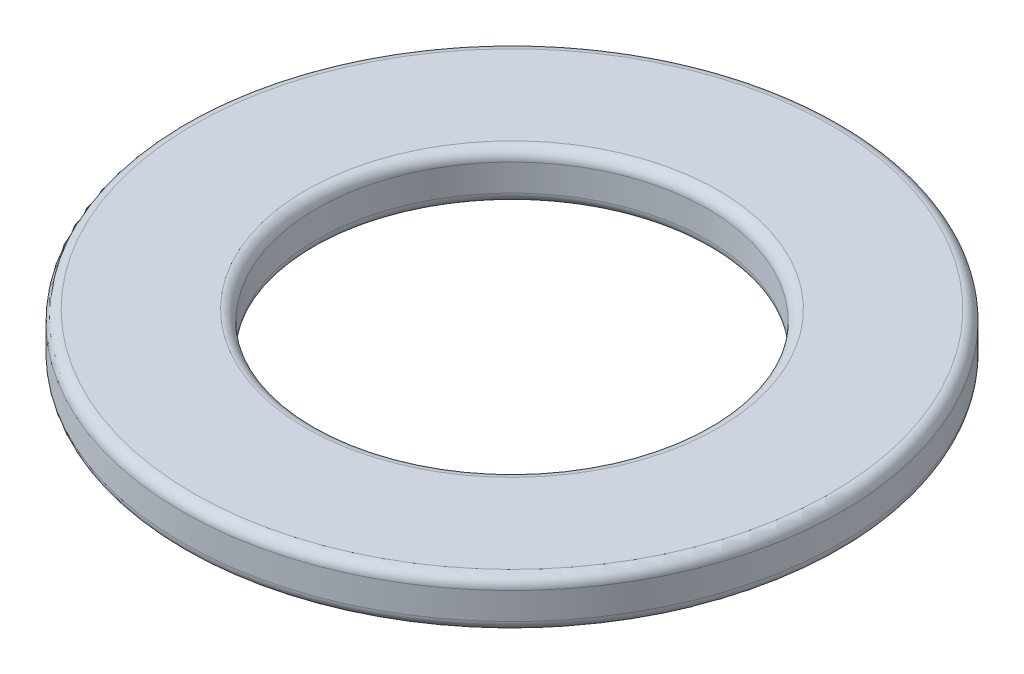
ISO-10303-21;
HEADER;
FILE_DESCRIPTION(('STEP AP214'),'2;1');
FILE_NAME('part.step','',(''),(''),'','','');
FILE_SCHEMA(('AUTOMOTIVE_DESIGN { 1 0 10303 214 1 1 1 1 }'));
ENDSEC;
DATA;
#1=APPLICATION_CONTEXT('core data for automotive mechanical design processes');
#2=APPLICATION_PROTOCOL_DEFINITION('international standard','automotive_design',2000,#1);
#3=PRODUCT_CONTEXT('',#1,'mechanical');
#4=PRODUCT('Part','Part','',(#3));
#5=PRODUCT_RELATED_PRODUCT_CATEGORY('part','',(#4));
#6=PRODUCT_DEFINITION_FORMATION('','',#4);
#7=PRODUCT_DEFINITION_CONTEXT('part definition',#1,'design');
#8=PRODUCT_DEFINITION('design','',#6,#7);
#9=PRODUCT_DEFINITION_SHAPE('','',#8);
#10=(LENGTH_UNIT() NAMED_UNIT(*) SI_UNIT(.MILLI.,.METRE.));
#11=(NAMED_UNIT(*) PLANE_ANGLE_UNIT() SI_UNIT($,.RADIAN.));
#12=(NAMED_UNIT(*) SI_UNIT($,.STERADIAN.) SOLID_ANGLE_UNIT());
#13=UNCERTAINTY_MEASURE_WITH_UNIT(LENGTH_MEASURE(1.E-05),#10,'distance_accuracy_value','');
#14=(GEOMETRIC_REPRESENTATION_CONTEXT(3) GLOBAL_UNCERTAINTY_ASSIGNED_CONTEXT((#13)) GLOBAL_UNIT_ASSIGNED_CONTEXT((#10,
#11,#12)) REPRESENTATION_CONTEXT('',''));
#15=CARTESIAN_POINT('',(0.,0.,0.));
#16=DIRECTION('',(0.,0.,1.));
#17=DIRECTION('',(1.,0.,0.));
#18=AXIS2_PLACEMENT_3D('',#15,#16,#17);
#19=CARTESIAN_POINT('',(0.,4.5,0.));
#20=DIRECTION('',(0.,1.,0.));
#21=DIRECTION('',(0.,0.,1.));
#22=AXIS2_PLACEMENT_3D('',#19,#20,#21);
#23=PLANE('',#22);
#24=CARTESIAN_POINT('',(0.,4.5,0.));
#25=DIRECTION('',(0.,1.,0.));
#26=DIRECTION('',(0.,0.,1.));
#27=AXIS2_PLACEMENT_3D('',#24,#25,#26);
#28=CIRCLE('',#27,29.7);
#29=CARTESIAN_POINT('',(0.,4.5,29.7));
#30=VERTEX_POINT('',#29);
#31=EDGE_CURVE('E40',#30,#30,#28,.T.);
#32=ORIENTED_EDGE('',*,*,#31,.T.);
#33=EDGE_LOOP('',(#32));
#34=FACE_BOUND('',#33,.T.);
#35=CARTESIAN_POINT('',(0.,4.5,0.));
#36=DIRECTION('',(0.,1.,0.));
#37=DIRECTION('',(0.,0.,1.));
#38=AXIS2_PLACEMENT_3D('',#35,#36,#37);
#39=CIRCLE('',#38,19.2);
#40=CARTESIAN_POINT('',(0.,4.5,19.2));
#41=VERTEX_POINT('',#40);
#42=EDGE_CURVE('E44',#41,#41,#39,.F.);
#43=ORIENTED_EDGE('',*,*,#42,.T.);
#44=EDGE_LOOP('',(#43));
#45=FACE_BOUND('',#44,.T.);
#46=ADVANCED_FACE('F29',(#34,#45),#23,.T.);
#47=CARTESIAN_POINT('',(0.,0.,0.));
#48=DIRECTION('',(0.,1.,0.));
#49=DIRECTION('',(0.,0.,1.));
#50=AXIS2_PLACEMENT_3D('',#47,#48,#49);
#51=PLANE('',#50);
#52=CARTESIAN_POINT('',(0.,0.,0.));
#53=DIRECTION('',(0.,1.,0.));
#54=DIRECTION('',(0.,0.,1.));
#55=AXIS2_PLACEMENT_3D('',#52,#53,#54);
#56=CIRCLE('',#55,29.7);
#57=CARTESIAN_POINT('',(0.,0.,29.7));
#58=VERTEX_POINT('',#57);
#59=EDGE_CURVE('E49',#58,#58,#56,.F.);
#60=ORIENTED_EDGE('',*,*,#59,.T.);
#61=EDGE_LOOP('',(#60));
#62=FACE_BOUND('',#61,.T.);
#63=CARTESIAN_POINT('',(0.,0.,0.));
#64=DIRECTION('',(0.,1.,0.));
#65=DIRECTION('',(0.,0.,1.));
#66=AXIS2_PLACEMENT_3D('',#63,#64,#65);
#67=CIRCLE('',#66,19.2);
#68=CARTESIAN_POINT('',(0.,0.,19.2));
#69=VERTEX_POINT('',#68);
#70=EDGE_CURVE('E52',#69,#69,#67,.T.);
#71=ORIENTED_EDGE('',*,*,#70,.T.);
#72=EDGE_LOOP('',(#71));
#73=FACE_BOUND('',#72,.T.);
#74=ADVANCED_FACE('F74',(#62,#73),#51,.F.);
#75=CARTESIAN_POINT('',(0.,4.5,0.));
#76=DIRECTION('',(0.,-1.,0.));
#77=DIRECTION('',(0.,0.,-1.));
#78=AXIS2_PLACEMENT_3D('',#75,#76,#77);
#79=CYLINDRICAL_SURFACE('',#78,30.7);
#80=CARTESIAN_POINT('',(0.,1.,0.));
#81=DIRECTION('',(0.,1.,0.));
#82=DIRECTION('',(0.,0.,1.));
#83=AXIS2_PLACEMENT_3D('',#80,#81,#82);
#84=CIRCLE('',#83,30.7);
#85=CARTESIAN_POINT('',(0.,1.,30.7));
#86=VERTEX_POINT('',#85);
#87=EDGE_CURVE('E55',#86,#86,#84,.T.);
#88=ORIENTED_EDGE('',*,*,#87,.T.);
#89=EDGE_LOOP('',(#88));
#90=FACE_BOUND('',#89,.T.);
#91=CARTESIAN_POINT('',(0.,3.5,0.));
#92=DIRECTION('',(0.,1.,0.));
#93=DIRECTION('',(0.,0.,1.));
#94=AXIS2_PLACEMENT_3D('',#91,#92,#93);
#95=CIRCLE('',#94,30.7);
#96=CARTESIAN_POINT('',(0.,3.5,30.7));
#97=VERTEX_POINT('',#96);
#98=EDGE_CURVE('E58',#97,#97,#95,.F.);
#99=ORIENTED_EDGE('',*,*,#98,.T.);
#100=EDGE_LOOP('',(#99));
#101=FACE_BOUND('',#100,.T.);
#102=ADVANCED_FACE('F62',(#90,#101),#79,.T.);
#103=CARTESIAN_POINT('',(0.,4.5,0.));
#104=DIRECTION('',(0.,-1.,0.));
#105=DIRECTION('',(0.,0.,-1.));
#106=AXIS2_PLACEMENT_3D('',#103,#104,#105);
#107=CYLINDRICAL_SURFACE('',#106,18.2);
#108=CARTESIAN_POINT('',(0.,1.,0.));
#109=DIRECTION('',(0.,1.,0.));
#110=DIRECTION('',(0.,0.,1.));
#111=AXIS2_PLACEMENT_3D('',#108,#109,#110);
#112=CIRCLE('',#111,18.2);
#113=CARTESIAN_POINT('',(0.,1.,18.2));
#114=VERTEX_POINT('',#113);
#115=EDGE_CURVE('E10',#114,#114,#112,.F.);
#116=ORIENTED_EDGE('',*,*,#115,.T.);
#117=EDGE_LOOP('',(#116));
#118=FACE_BOUND('',#117,.T.);
#119=CARTESIAN_POINT('',(0.,3.5,0.));
#120=DIRECTION('',(0.,1.,0.));
#121=DIRECTION('',(0.,0.,1.));
#122=AXIS2_PLACEMENT_3D('',#119,#120,#121);
#123=CIRCLE('',#122,18.2);
#124=CARTESIAN_POINT('',(0.,3.5,18.2));
#125=VERTEX_POINT('',#124);
#126=EDGE_CURVE('E36',#125,#125,#123,.T.);
#127=ORIENTED_EDGE('',*,*,#126,.T.);
#128=EDGE_LOOP('',(#127));
#129=FACE_BOUND('',#128,.T.);
#130=ADVANCED_FACE('F90',(#118,#129),#107,.F.);
#131=CARTESIAN_POINT('',(0.,1.,0.));
#132=DIRECTION('',(0.,1.,0.));
#133=DIRECTION('',(0.,0.,1.));
#134=AXIS2_PLACEMENT_3D('',#131,#132,#133);
#135=TOROIDAL_SURFACE('',#134,29.7,1.);
#136=ORIENTED_EDGE('',*,*,#59,.F.);
#137=EDGE_LOOP('',(#136));
#138=FACE_BOUND('',#137,.T.);
#139=ORIENTED_EDGE('',*,*,#87,.F.);
#140=EDGE_LOOP('',(#139));
#141=FACE_BOUND('',#140,.T.);
#142=ADVANCED_FACE('F68',(#138,#141),#135,.T.);
#143=CARTESIAN_POINT('',(0.,3.5,0.));
#144=DIRECTION('',(0.,1.,0.));
#145=DIRECTION('',(0.,0.,1.));
#146=AXIS2_PLACEMENT_3D('',#143,#144,#145);
#147=TOROIDAL_SURFACE('',#146,29.7,1.);
#148=ORIENTED_EDGE('',*,*,#98,.F.);
#149=EDGE_LOOP('',(#148));
#150=FACE_BOUND('',#149,.T.);
#151=ORIENTED_EDGE('',*,*,#31,.F.);
#152=EDGE_LOOP('',(#151));
#153=FACE_BOUND('',#152,.T.);
#154=ADVANCED_FACE('F64',(#150,#153),#147,.T.);
#155=CARTESIAN_POINT('',(0.,1.,0.));
#156=DIRECTION('',(0.,1.,0.));
#157=DIRECTION('',(0.,0.,1.));
#158=AXIS2_PLACEMENT_3D('',#155,#156,#157);
#159=TOROIDAL_SURFACE('',#158,19.2,1.);
#160=ORIENTED_EDGE('',*,*,#115,.F.);
#161=EDGE_LOOP('',(#160));
#162=FACE_BOUND('',#161,.T.);
#163=ORIENTED_EDGE('',*,*,#70,.F.);
#164=EDGE_LOOP('',(#163));
#165=FACE_BOUND('',#164,.T.);
#166=ADVANCED_FACE('F67',(#162,#165),#159,.T.);
#167=CARTESIAN_POINT('',(0.,3.5,0.));
#168=DIRECTION('',(0.,1.,0.));
#169=DIRECTION('',(0.,0.,1.));
#170=AXIS2_PLACEMENT_3D('',#167,#168,#169);
#171=TOROIDAL_SURFACE('',#170,19.2,1.);
#172=ORIENTED_EDGE('',*,*,#42,.F.);
#173=EDGE_LOOP('',(#172));
#174=FACE_BOUND('',#173,.T.);
#175=ORIENTED_EDGE('',*,*,#126,.F.);
#176=EDGE_LOOP('',(#175));
#177=FACE_BOUND('',#176,.T.);
#178=ADVANCED_FACE('F31',(#174,#177),#171,.T.);
#179=CLOSED_SHELL('',(#46,#74,#102,#130,#142,#154,#166,#178));
#180=MANIFOLD_SOLID_BREP('B2',#179);
#181=ADVANCED_BREP_SHAPE_REPRESENTATION('',(#18,#180),#14);
#182=SHAPE_DEFINITION_REPRESENTATION(#9,#181);
ENDSEC;
END-ISO-10303-21;
